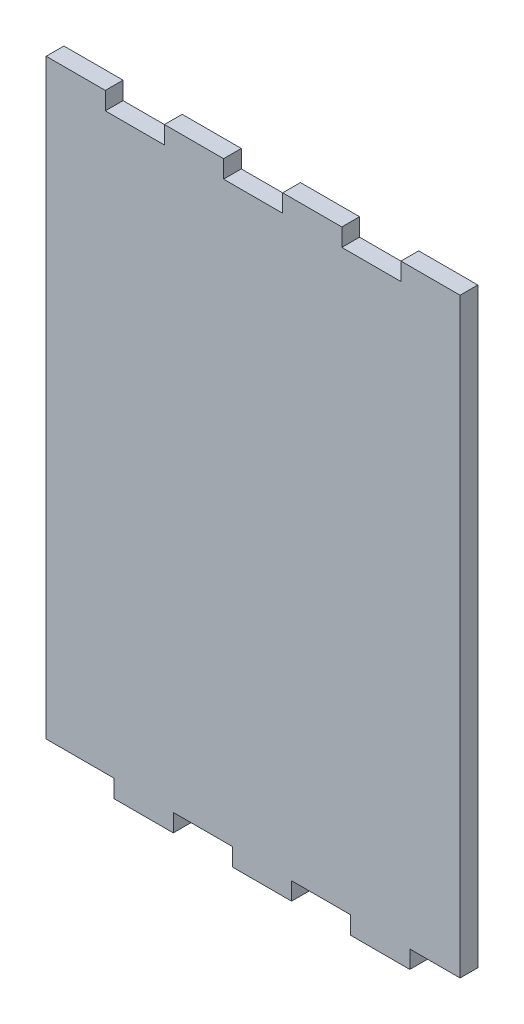
ISO-10303-21;
HEADER;
FILE_DESCRIPTION(('STEP AP214'),'2;1');
FILE_NAME('part.step','',(''),(''),'','','');
FILE_SCHEMA(('AUTOMOTIVE_DESIGN { 1 0 10303 214 1 1 1 1 }'));
ENDSEC;
DATA;
#1=APPLICATION_CONTEXT('core data for automotive mechanical design processes');
#2=APPLICATION_PROTOCOL_DEFINITION('international standard','automotive_design',2000,#1);
#3=PRODUCT_CONTEXT('',#1,'mechanical');
#4=PRODUCT('Part','Part','',(#3));
#5=PRODUCT_RELATED_PRODUCT_CATEGORY('part','',(#4));
#6=PRODUCT_DEFINITION_FORMATION('','',#4);
#7=PRODUCT_DEFINITION_CONTEXT('part definition',#1,'design');
#8=PRODUCT_DEFINITION('design','',#6,#7);
#9=PRODUCT_DEFINITION_SHAPE('','',#8);
#10=(LENGTH_UNIT() NAMED_UNIT(*) SI_UNIT(.MILLI.,.METRE.));
#11=(NAMED_UNIT(*) PLANE_ANGLE_UNIT() SI_UNIT($,.RADIAN.));
#12=(NAMED_UNIT(*) SI_UNIT($,.STERADIAN.) SOLID_ANGLE_UNIT());
#13=UNCERTAINTY_MEASURE_WITH_UNIT(LENGTH_MEASURE(1.E-05),#10,'distance_accuracy_value','');
#14=(GEOMETRIC_REPRESENTATION_CONTEXT(3) GLOBAL_UNCERTAINTY_ASSIGNED_CONTEXT((#13)) GLOBAL_UNIT_ASSIGNED_CONTEXT((#10,
#11,#12)) REPRESENTATION_CONTEXT('',''));
#15=CARTESIAN_POINT('',(0.,0.,0.));
#16=DIRECTION('',(0.,0.,1.));
#17=DIRECTION('',(1.,0.,0.));
#18=AXIS2_PLACEMENT_3D('',#15,#16,#17);
#19=CARTESIAN_POINT('',(0.,50.,3.));
#20=DIRECTION('',(0.,1.,0.));
#21=DIRECTION('',(0.,0.,1.));
#22=AXIS2_PLACEMENT_3D('',#19,#20,#21);
#23=PLANE('',#22);
#24=DIRECTION('',(0.,0.,1.));
#25=VECTOR('',#24,1.);
#26=CARTESIAN_POINT('',(-25.,50.,0.));
#27=LINE('',#26,#25);
#28=CARTESIAN_POINT('',(-25.,50.,0.));
#29=VERTEX_POINT('',#28);
#30=CARTESIAN_POINT('',(-25.,50.,3.));
#31=VERTEX_POINT('',#30);
#32=EDGE_CURVE('E268',#29,#31,#27,.T.);
#33=ORIENTED_EDGE('',*,*,#32,.F.);
#34=DIRECTION('',(1.,0.,0.));
#35=VECTOR('',#34,1.);
#36=CARTESIAN_POINT('',(0.,50.,0.));
#37=LINE('',#36,#35);
#38=CARTESIAN_POINT('',(-35.,50.,0.));
#39=VERTEX_POINT('',#38);
#40=EDGE_CURVE('E253',#39,#29,#37,.T.);
#41=ORIENTED_EDGE('',*,*,#40,.F.);
#42=DIRECTION('',(0.,0.,-1.));
#43=VECTOR('',#42,1.);
#44=CARTESIAN_POINT('',(-35.,50.,3.));
#45=LINE('',#44,#43);
#46=CARTESIAN_POINT('',(-35.,50.,3.));
#47=VERTEX_POINT('',#46);
#48=EDGE_CURVE('E453',#47,#39,#45,.T.);
#49=ORIENTED_EDGE('',*,*,#48,.F.);
#50=DIRECTION('',(1.,0.,0.));
#51=VECTOR('',#50,1.);
#52=CARTESIAN_POINT('',(0.,50.,3.));
#53=LINE('',#52,#51);
#54=EDGE_CURVE('E391',#47,#31,#53,.T.);
#55=ORIENTED_EDGE('',*,*,#54,.T.);
#56=EDGE_LOOP('',(#33,#41,#49,#55));
#57=FACE_BOUND('',#56,.T.);
#58=ADVANCED_FACE('F44',(#57),#23,.T.);
#59=DIRECTION('',(0.,0.,1.));
#60=VECTOR('',#59,1.);
#61=CARTESIAN_POINT('',(15.,50.,0.));
#62=LINE('',#61,#60);
#63=CARTESIAN_POINT('',(15.,50.,0.));
#64=VERTEX_POINT('',#63);
#65=CARTESIAN_POINT('',(15.,50.,3.));
#66=VERTEX_POINT('',#65);
#67=EDGE_CURVE('E288',#64,#66,#62,.T.);
#68=ORIENTED_EDGE('',*,*,#67,.F.);
#69=CARTESIAN_POINT('',(5.,50.,0.));
#70=VERTEX_POINT('',#69);
#71=EDGE_CURVE('E535',#70,#64,#37,.T.);
#72=ORIENTED_EDGE('',*,*,#71,.F.);
#73=DIRECTION('',(0.,0.,1.));
#74=VECTOR('',#73,1.);
#75=CARTESIAN_POINT('',(5.,50.,0.));
#76=LINE('',#75,#74);
#77=CARTESIAN_POINT('',(5.,50.,3.));
#78=VERTEX_POINT('',#77);
#79=EDGE_CURVE('E319',#70,#78,#76,.T.);
#80=ORIENTED_EDGE('',*,*,#79,.T.);
#81=EDGE_CURVE('E822',#78,#66,#53,.T.);
#82=ORIENTED_EDGE('',*,*,#81,.T.);
#83=EDGE_LOOP('',(#68,#72,#80,#82));
#84=FACE_BOUND('',#83,.T.);
#85=ADVANCED_FACE('F605',(#84),#23,.T.);
#86=DIRECTION('',(0.,0.,1.));
#87=VECTOR('',#86,1.);
#88=CARTESIAN_POINT('',(-15.,50.,0.));
#89=LINE('',#88,#87);
#90=CARTESIAN_POINT('',(-15.,50.,0.));
#91=VERTEX_POINT('',#90);
#92=CARTESIAN_POINT('',(-15.,50.,3.));
#93=VERTEX_POINT('',#92);
#94=EDGE_CURVE('E272',#91,#93,#89,.T.);
#95=ORIENTED_EDGE('',*,*,#94,.T.);
#96=CARTESIAN_POINT('',(-5.,50.,3.));
#97=VERTEX_POINT('',#96);
#98=EDGE_CURVE('E396',#93,#97,#53,.T.);
#99=ORIENTED_EDGE('',*,*,#98,.T.);
#100=DIRECTION('',(0.,0.,1.));
#101=VECTOR('',#100,1.);
#102=CARTESIAN_POINT('',(-5.,50.,0.));
#103=LINE('',#102,#101);
#104=CARTESIAN_POINT('',(-5.,50.,0.));
#105=VERTEX_POINT('',#104);
#106=EDGE_CURVE('E323',#105,#97,#103,.T.);
#107=ORIENTED_EDGE('',*,*,#106,.F.);
#108=EDGE_CURVE('E448',#91,#105,#37,.T.);
#109=ORIENTED_EDGE('',*,*,#108,.F.);
#110=EDGE_LOOP('',(#95,#99,#107,#109));
#111=FACE_BOUND('',#110,.T.);
#112=ADVANCED_FACE('F531',(#111),#23,.T.);
#113=CARTESIAN_POINT('',(0.,-50.,3.));
#114=DIRECTION('',(0.,1.,0.));
#115=DIRECTION('',(0.,0.,1.));
#116=AXIS2_PLACEMENT_3D('',#113,#114,#115);
#117=PLANE('',#116);
#118=DIRECTION('',(1.,0.,0.));
#119=VECTOR('',#118,1.);
#120=CARTESIAN_POINT('',(0.,-50.,0.));
#121=LINE('',#120,#119);
#122=CARTESIAN_POINT('',(-35.,-50.,0.));
#123=VERTEX_POINT('',#122);
#124=CARTESIAN_POINT('',(-23.5,-50.,0.));
#125=VERTEX_POINT('',#124);
#126=EDGE_CURVE('E271',#123,#125,#121,.T.);
#127=ORIENTED_EDGE('',*,*,#126,.T.);
#128=DIRECTION('',(0.,0.,-1.));
#129=VECTOR('',#128,1.);
#130=CARTESIAN_POINT('',(-23.5,-50.,3.));
#131=LINE('',#130,#129);
#132=CARTESIAN_POINT('',(-23.5,-50.,3.));
#133=VERTEX_POINT('',#132);
#134=EDGE_CURVE('E11',#133,#125,#131,.T.);
#135=ORIENTED_EDGE('',*,*,#134,.F.);
#136=DIRECTION('',(1.,0.,0.));
#137=VECTOR('',#136,1.);
#138=CARTESIAN_POINT('',(0.,-50.,3.));
#139=LINE('',#138,#137);
#140=CARTESIAN_POINT('',(-35.,-50.,3.));
#141=VERTEX_POINT('',#140);
#142=EDGE_CURVE('E347',#141,#133,#139,.T.);
#143=ORIENTED_EDGE('',*,*,#142,.F.);
#144=DIRECTION('',(0.,0.,-1.));
#145=VECTOR('',#144,1.);
#146=CARTESIAN_POINT('',(-35.,-50.,3.));
#147=LINE('',#146,#145);
#148=EDGE_CURVE('E400',#141,#123,#147,.T.);
#149=ORIENTED_EDGE('',*,*,#148,.T.);
#150=EDGE_LOOP('',(#127,#135,#143,#149));
#151=FACE_BOUND('',#150,.T.);
#152=ADVANCED_FACE('F519',(#151),#117,.F.);
#153=CARTESIAN_POINT('',(-23.5,0.,3.));
#154=DIRECTION('',(1.,0.,0.));
#155=DIRECTION('',(0.,0.,-1.));
#156=AXIS2_PLACEMENT_3D('',#153,#154,#155);
#157=PLANE('',#156);
#158=DIRECTION('',(0.,-1.,0.));
#159=VECTOR('',#158,1.);
#160=CARTESIAN_POINT('',(-23.5,0.,0.));
#161=LINE('',#160,#159);
#162=CARTESIAN_POINT('',(-23.5,-53.,0.));
#163=VERTEX_POINT('',#162);
#164=EDGE_CURVE('E404',#125,#163,#161,.T.);
#165=ORIENTED_EDGE('',*,*,#164,.T.);
#166=DIRECTION('',(0.,0.,-1.));
#167=VECTOR('',#166,1.);
#168=CARTESIAN_POINT('',(-23.5,-53.,3.));
#169=LINE('',#168,#167);
#170=CARTESIAN_POINT('',(-23.5,-53.,3.));
#171=VERTEX_POINT('',#170);
#172=EDGE_CURVE('E53',#171,#163,#169,.T.);
#173=ORIENTED_EDGE('',*,*,#172,.F.);
#174=DIRECTION('',(0.,-1.,0.));
#175=VECTOR('',#174,1.);
#176=CARTESIAN_POINT('',(-23.5,0.,3.));
#177=LINE('',#176,#175);
#178=EDGE_CURVE('E351',#133,#171,#177,.T.);
#179=ORIENTED_EDGE('',*,*,#178,.F.);
#180=ORIENTED_EDGE('',*,*,#134,.T.);
#181=EDGE_LOOP('',(#165,#173,#179,#180));
#182=FACE_BOUND('',#181,.T.);
#183=ADVANCED_FACE('F46',(#182),#157,.F.);
#184=CARTESIAN_POINT('',(0.,-53.,3.));
#185=DIRECTION('',(0.,-1.,0.));
#186=DIRECTION('',(1.,0.,0.));
#187=AXIS2_PLACEMENT_3D('',#184,#185,#186);
#188=PLANE('',#187);
#189=DIRECTION('',(-1.,0.,0.));
#190=VECTOR('',#189,1.);
#191=CARTESIAN_POINT('',(0.,-53.,0.));
#192=LINE('',#191,#190);
#193=CARTESIAN_POINT('',(-13.5,-53.,0.));
#194=VERTEX_POINT('',#193);
#195=EDGE_CURVE('E410',#194,#163,#192,.T.);
#196=ORIENTED_EDGE('',*,*,#195,.F.);
#197=DIRECTION('',(0.,0.,-1.));
#198=VECTOR('',#197,1.);
#199=CARTESIAN_POINT('',(-13.5,-53.,3.));
#200=LINE('',#199,#198);
#201=CARTESIAN_POINT('',(-13.5,-53.,3.));
#202=VERTEX_POINT('',#201);
#203=EDGE_CURVE('E495',#202,#194,#200,.T.);
#204=ORIENTED_EDGE('',*,*,#203,.F.);
#205=DIRECTION('',(-1.,0.,0.));
#206=VECTOR('',#205,1.);
#207=CARTESIAN_POINT('',(0.,-53.,3.));
#208=LINE('',#207,#206);
#209=EDGE_CURVE('E357',#202,#171,#208,.T.);
#210=ORIENTED_EDGE('',*,*,#209,.T.);
#211=ORIENTED_EDGE('',*,*,#172,.T.);
#212=EDGE_LOOP('',(#196,#204,#210,#211));
#213=FACE_BOUND('',#212,.T.);
#214=ADVANCED_FACE('F501',(#213),#188,.T.);
#215=CARTESIAN_POINT('',(-13.5,0.,3.));
#216=DIRECTION('',(1.,0.,0.));
#217=DIRECTION('',(0.,0.,-1.));
#218=AXIS2_PLACEMENT_3D('',#215,#216,#217);
#219=PLANE('',#218);
#220=DIRECTION('',(0.,-1.,0.));
#221=VECTOR('',#220,1.);
#222=CARTESIAN_POINT('',(-13.5,0.,0.));
#223=LINE('',#222,#221);
#224=CARTESIAN_POINT('',(-13.5,-50.,0.));
#225=VERTEX_POINT('',#224);
#226=EDGE_CURVE('E414',#225,#194,#223,.T.);
#227=ORIENTED_EDGE('',*,*,#226,.F.);
#228=DIRECTION('',(0.,0.,-1.));
#229=VECTOR('',#228,1.);
#230=CARTESIAN_POINT('',(-13.5,-50.,3.));
#231=LINE('',#230,#229);
#232=CARTESIAN_POINT('',(-13.5,-50.,3.));
#233=VERTEX_POINT('',#232);
#234=EDGE_CURVE('E492',#233,#225,#231,.T.);
#235=ORIENTED_EDGE('',*,*,#234,.F.);
#236=DIRECTION('',(0.,-1.,0.));
#237=VECTOR('',#236,1.);
#238=CARTESIAN_POINT('',(-13.5,0.,3.));
#239=LINE('',#238,#237);
#240=EDGE_CURVE('E361',#233,#202,#239,.T.);
#241=ORIENTED_EDGE('',*,*,#240,.T.);
#242=ORIENTED_EDGE('',*,*,#203,.T.);
#243=EDGE_LOOP('',(#227,#235,#241,#242));
#244=FACE_BOUND('',#243,.T.);
#245=ADVANCED_FACE('F510',(#244),#219,.T.);
#246=CARTESIAN_POINT('',(-3.5,-50.,0.));
#247=VERTEX_POINT('',#246);
#248=EDGE_CURVE('E406',#225,#247,#121,.T.);
#249=ORIENTED_EDGE('',*,*,#248,.T.);
#250=DIRECTION('',(0.,0.,-1.));
#251=VECTOR('',#250,1.);
#252=CARTESIAN_POINT('',(-3.5,-50.,3.));
#253=LINE('',#252,#251);
#254=CARTESIAN_POINT('',(-3.5,-50.,3.));
#255=VERTEX_POINT('',#254);
#256=EDGE_CURVE('E488',#255,#247,#253,.T.);
#257=ORIENTED_EDGE('',*,*,#256,.F.);
#258=EDGE_CURVE('E354',#233,#255,#139,.T.);
#259=ORIENTED_EDGE('',*,*,#258,.F.);
#260=ORIENTED_EDGE('',*,*,#234,.T.);
#261=EDGE_LOOP('',(#249,#257,#259,#260));
#262=FACE_BOUND('',#261,.T.);
#263=ADVANCED_FACE('F564',(#262),#117,.F.);
#264=CARTESIAN_POINT('',(-3.50000000000001,0.,3.));
#265=DIRECTION('',(1.,0.,0.));
#266=DIRECTION('',(0.,1.,0.));
#267=AXIS2_PLACEMENT_3D('',#264,#265,#266);
#268=PLANE('',#267);
#269=DIRECTION('',(0.,-1.,0.));
#270=VECTOR('',#269,1.);
#271=CARTESIAN_POINT('',(-3.50000000000001,0.,0.));
#272=LINE('',#271,#270);
#273=CARTESIAN_POINT('',(-3.5,-53.,0.));
#274=VERTEX_POINT('',#273);
#275=EDGE_CURVE('E418',#247,#274,#272,.T.);
#276=ORIENTED_EDGE('',*,*,#275,.T.);
#277=DIRECTION('',(0.,0.,-1.));
#278=VECTOR('',#277,1.);
#279=CARTESIAN_POINT('',(-3.5,-53.,3.));
#280=LINE('',#279,#278);
#281=CARTESIAN_POINT('',(-3.5,-53.,3.));
#282=VERTEX_POINT('',#281);
#283=EDGE_CURVE('E484',#282,#274,#280,.T.);
#284=ORIENTED_EDGE('',*,*,#283,.F.);
#285=DIRECTION('',(0.,-1.,0.));
#286=VECTOR('',#285,1.);
#287=CARTESIAN_POINT('',(-3.50000000000001,0.,3.));
#288=LINE('',#287,#286);
#289=EDGE_CURVE('E365',#255,#282,#288,.T.);
#290=ORIENTED_EDGE('',*,*,#289,.F.);
#291=ORIENTED_EDGE('',*,*,#256,.T.);
#292=EDGE_LOOP('',(#276,#284,#290,#291));
#293=FACE_BOUND('',#292,.T.);
#294=ADVANCED_FACE('F567',(#293),#268,.F.);
#295=CARTESIAN_POINT('',(0.,-53.,3.));
#296=DIRECTION('',(0.,1.,0.));
#297=DIRECTION('',(0.,0.,1.));
#298=AXIS2_PLACEMENT_3D('',#295,#296,#297);
#299=PLANE('',#298);
#300=DIRECTION('',(1.,0.,0.));
#301=VECTOR('',#300,1.);
#302=CARTESIAN_POINT('',(0.,-53.,0.));
#303=LINE('',#302,#301);
#304=CARTESIAN_POINT('',(6.5,-53.,0.));
#305=VERTEX_POINT('',#304);
#306=EDGE_CURVE('E421',#274,#305,#303,.T.);
#307=ORIENTED_EDGE('',*,*,#306,.T.);
#308=DIRECTION('',(0.,0.,-1.));
#309=VECTOR('',#308,1.);
#310=CARTESIAN_POINT('',(6.5,-53.,3.));
#311=LINE('',#310,#309);
#312=CARTESIAN_POINT('',(6.5,-53.,3.));
#313=VERTEX_POINT('',#312);
#314=EDGE_CURVE('E481',#313,#305,#311,.T.);
#315=ORIENTED_EDGE('',*,*,#314,.F.);
#316=DIRECTION('',(1.,0.,0.));
#317=VECTOR('',#316,1.);
#318=CARTESIAN_POINT('',(0.,-53.,3.));
#319=LINE('',#318,#317);
#320=EDGE_CURVE('E368',#282,#313,#319,.T.);
#321=ORIENTED_EDGE('',*,*,#320,.F.);
#322=ORIENTED_EDGE('',*,*,#283,.T.);
#323=EDGE_LOOP('',(#307,#315,#321,#322));
#324=FACE_BOUND('',#323,.T.);
#325=ADVANCED_FACE('F573',(#324),#299,.F.);
#326=CARTESIAN_POINT('',(6.5,0.,3.));
#327=DIRECTION('',(1.,0.,0.));
#328=DIRECTION('',(0.,0.,-1.));
#329=AXIS2_PLACEMENT_3D('',#326,#327,#328);
#330=PLANE('',#329);
#331=DIRECTION('',(0.,-1.,0.));
#332=VECTOR('',#331,1.);
#333=CARTESIAN_POINT('',(6.5,0.,0.));
#334=LINE('',#333,#332);
#335=CARTESIAN_POINT('',(6.5,-50.,0.));
#336=VERTEX_POINT('',#335);
#337=EDGE_CURVE('E425',#336,#305,#334,.T.);
#338=ORIENTED_EDGE('',*,*,#337,.F.);
#339=DIRECTION('',(0.,0.,-1.));
#340=VECTOR('',#339,1.);
#341=CARTESIAN_POINT('',(6.5,-50.,3.));
#342=LINE('',#341,#340);
#343=CARTESIAN_POINT('',(6.5,-50.,3.));
#344=VERTEX_POINT('',#343);
#345=EDGE_CURVE('E478',#344,#336,#342,.T.);
#346=ORIENTED_EDGE('',*,*,#345,.F.);
#347=DIRECTION('',(0.,-1.,0.));
#348=VECTOR('',#347,1.);
#349=CARTESIAN_POINT('',(6.5,0.,3.));
#350=LINE('',#349,#348);
#351=EDGE_CURVE('E371',#344,#313,#350,.T.);
#352=ORIENTED_EDGE('',*,*,#351,.T.);
#353=ORIENTED_EDGE('',*,*,#314,.T.);
#354=EDGE_LOOP('',(#338,#346,#352,#353));
#355=FACE_BOUND('',#354,.T.);
#356=ADVANCED_FACE('F594',(#355),#330,.T.);
#357=CARTESIAN_POINT('',(16.5,-50.,0.));
#358=VERTEX_POINT('',#357);
#359=EDGE_CURVE('E429',#336,#358,#121,.T.);
#360=ORIENTED_EDGE('',*,*,#359,.T.);
#361=DIRECTION('',(0.,0.,-1.));
#362=VECTOR('',#361,1.);
#363=CARTESIAN_POINT('',(16.5,-50.,3.));
#364=LINE('',#363,#362);
#365=CARTESIAN_POINT('',(16.5,-50.,3.));
#366=VERTEX_POINT('',#365);
#367=EDGE_CURVE('E474',#366,#358,#364,.T.);
#368=ORIENTED_EDGE('',*,*,#367,.F.);
#369=EDGE_CURVE('E375',#344,#366,#139,.T.);
#370=ORIENTED_EDGE('',*,*,#369,.F.);
#371=ORIENTED_EDGE('',*,*,#345,.T.);
#372=EDGE_LOOP('',(#360,#368,#370,#371));
#373=FACE_BOUND('',#372,.T.);
#374=ADVANCED_FACE('F592',(#373),#117,.F.);
#375=CARTESIAN_POINT('',(16.5000000000001,0.,3.));
#376=DIRECTION('',(1.,0.,0.));
#377=DIRECTION('',(0.,1.,0.));
#378=AXIS2_PLACEMENT_3D('',#375,#376,#377);
#379=PLANE('',#378);
#380=DIRECTION('',(0.,-1.,0.));
#381=VECTOR('',#380,1.);
#382=CARTESIAN_POINT('',(16.5000000000001,0.,0.));
#383=LINE('',#382,#381);
#384=CARTESIAN_POINT('',(16.5,-53.,0.));
#385=VERTEX_POINT('',#384);
#386=EDGE_CURVE('E430',#358,#385,#383,.T.);
#387=ORIENTED_EDGE('',*,*,#386,.T.);
#388=DIRECTION('',(0.,0.,-1.));
#389=VECTOR('',#388,1.);
#390=CARTESIAN_POINT('',(16.5,-53.,3.));
#391=LINE('',#390,#389);
#392=CARTESIAN_POINT('',(16.5,-53.,3.));
#393=VERTEX_POINT('',#392);
#394=EDGE_CURVE('E470',#393,#385,#391,.T.);
#395=ORIENTED_EDGE('',*,*,#394,.F.);
#396=DIRECTION('',(0.,-1.,0.));
#397=VECTOR('',#396,1.);
#398=CARTESIAN_POINT('',(16.5000000000001,0.,3.));
#399=LINE('',#398,#397);
#400=EDGE_CURVE('E376',#366,#393,#399,.T.);
#401=ORIENTED_EDGE('',*,*,#400,.F.);
#402=ORIENTED_EDGE('',*,*,#367,.T.);
#403=EDGE_LOOP('',(#387,#395,#401,#402));
#404=FACE_BOUND('',#403,.T.);
#405=ADVANCED_FACE('F591',(#404),#379,.F.);
#406=CARTESIAN_POINT('',(0.,-53.,3.));
#407=DIRECTION('',(0.,1.,0.));
#408=DIRECTION('',(-1.,0.,0.));
#409=AXIS2_PLACEMENT_3D('',#406,#407,#408);
#410=PLANE('',#409);
#411=DIRECTION('',(1.,0.,0.));
#412=VECTOR('',#411,1.);
#413=CARTESIAN_POINT('',(0.,-53.,0.));
#414=LINE('',#413,#412);
#415=CARTESIAN_POINT('',(26.5,-53.,0.));
#416=VERTEX_POINT('',#415);
#417=EDGE_CURVE('E433',#385,#416,#414,.T.);
#418=ORIENTED_EDGE('',*,*,#417,.T.);
#419=DIRECTION('',(0.,0.,-1.));
#420=VECTOR('',#419,1.);
#421=CARTESIAN_POINT('',(26.5,-53.,3.));
#422=LINE('',#421,#420);
#423=CARTESIAN_POINT('',(26.5,-53.,3.));
#424=VERTEX_POINT('',#423);
#425=EDGE_CURVE('E467',#424,#416,#422,.T.);
#426=ORIENTED_EDGE('',*,*,#425,.F.);
#427=DIRECTION('',(1.,0.,0.));
#428=VECTOR('',#427,1.);
#429=CARTESIAN_POINT('',(0.,-53.,3.));
#430=LINE('',#429,#428);
#431=EDGE_CURVE('E379',#393,#424,#430,.T.);
#432=ORIENTED_EDGE('',*,*,#431,.F.);
#433=ORIENTED_EDGE('',*,*,#394,.T.);
#434=EDGE_LOOP('',(#418,#426,#432,#433));
#435=FACE_BOUND('',#434,.T.);
#436=ADVANCED_FACE('F587',(#435),#410,.F.);
#437=CARTESIAN_POINT('',(26.5,0.,3.));
#438=DIRECTION('',(1.,0.,0.));
#439=DIRECTION('',(0.,0.,-1.));
#440=AXIS2_PLACEMENT_3D('',#437,#438,#439);
#441=PLANE('',#440);
#442=DIRECTION('',(0.,-1.,0.));
#443=VECTOR('',#442,1.);
#444=CARTESIAN_POINT('',(26.5,0.,0.));
#445=LINE('',#444,#443);
#446=CARTESIAN_POINT('',(26.5,-50.,0.));
#447=VERTEX_POINT('',#446);
#448=EDGE_CURVE('E437',#447,#416,#445,.T.);
#449=ORIENTED_EDGE('',*,*,#448,.F.);
#450=DIRECTION('',(0.,0.,-1.));
#451=VECTOR('',#450,1.);
#452=CARTESIAN_POINT('',(26.5,-50.,3.));
#453=LINE('',#452,#451);
#454=CARTESIAN_POINT('',(26.5,-50.,3.));
#455=VERTEX_POINT('',#454);
#456=EDGE_CURVE('E464',#455,#447,#453,.T.);
#457=ORIENTED_EDGE('',*,*,#456,.F.);
#458=DIRECTION('',(0.,-1.,0.));
#459=VECTOR('',#458,1.);
#460=CARTESIAN_POINT('',(26.5,0.,3.));
#461=LINE('',#460,#459);
#462=EDGE_CURVE('E382',#455,#424,#461,.T.);
#463=ORIENTED_EDGE('',*,*,#462,.T.);
#464=ORIENTED_EDGE('',*,*,#425,.T.);
#465=EDGE_LOOP('',(#449,#457,#463,#464));
#466=FACE_BOUND('',#465,.T.);
#467=ADVANCED_FACE('F583',(#466),#441,.T.);
#468=CARTESIAN_POINT('',(35.,-50.,0.));
#469=VERTEX_POINT('',#468);
#470=EDGE_CURVE('E405',#447,#469,#121,.T.);
#471=ORIENTED_EDGE('',*,*,#470,.T.);
#472=DIRECTION('',(0.,0.,-1.));
#473=VECTOR('',#472,1.);
#474=CARTESIAN_POINT('',(35.,-50.,3.));
#475=LINE('',#474,#473);
#476=CARTESIAN_POINT('',(35.,-50.,3.));
#477=VERTEX_POINT('',#476);
#478=EDGE_CURVE('E460',#477,#469,#475,.T.);
#479=ORIENTED_EDGE('',*,*,#478,.F.);
#480=EDGE_CURVE('E353',#455,#477,#139,.T.);
#481=ORIENTED_EDGE('',*,*,#480,.F.);
#482=ORIENTED_EDGE('',*,*,#456,.T.);
#483=EDGE_LOOP('',(#471,#479,#481,#482));
#484=FACE_BOUND('',#483,.T.);
#485=ADVANCED_FACE('F553',(#484),#117,.F.);
#486=CARTESIAN_POINT('',(35.,0.,3.));
#487=DIRECTION('',(-1.,0.,0.));
#488=DIRECTION('',(0.,0.,1.));
#489=AXIS2_PLACEMENT_3D('',#486,#487,#488);
#490=PLANE('',#489);
#491=DIRECTION('',(0.,1.,0.));
#492=VECTOR('',#491,1.);
#493=CARTESIAN_POINT('',(35.,0.,0.));
#494=LINE('',#493,#492);
#495=CARTESIAN_POINT('',(35.,50.,0.));
#496=VERTEX_POINT('',#495);
#497=EDGE_CURVE('E441',#469,#496,#494,.T.);
#498=ORIENTED_EDGE('',*,*,#497,.T.);
#499=DIRECTION('',(0.,0.,-1.));
#500=VECTOR('',#499,1.);
#501=CARTESIAN_POINT('',(35.,50.,3.));
#502=LINE('',#501,#500);
#503=CARTESIAN_POINT('',(35.,50.,3.));
#504=VERTEX_POINT('',#503);
#505=EDGE_CURVE('E456',#504,#496,#502,.T.);
#506=ORIENTED_EDGE('',*,*,#505,.F.);
#507=DIRECTION('',(0.,1.,0.));
#508=VECTOR('',#507,1.);
#509=CARTESIAN_POINT('',(35.,0.,3.));
#510=LINE('',#509,#508);
#511=EDGE_CURVE('E386',#477,#504,#510,.T.);
#512=ORIENTED_EDGE('',*,*,#511,.F.);
#513=ORIENTED_EDGE('',*,*,#478,.T.);
#514=EDGE_LOOP('',(#498,#506,#512,#513));
#515=FACE_BOUND('',#514,.T.);
#516=ADVANCED_FACE('F549',(#515),#490,.F.);
#517=DIRECTION('',(0.,0.,1.));
#518=VECTOR('',#517,1.);
#519=CARTESIAN_POINT('',(25.,50.,0.));
#520=LINE('',#519,#518);
#521=CARTESIAN_POINT('',(25.,50.,0.));
#522=VERTEX_POINT('',#521);
#523=CARTESIAN_POINT('',(25.,50.,3.));
#524=VERTEX_POINT('',#523);
#525=EDGE_CURVE('E284',#522,#524,#520,.T.);
#526=ORIENTED_EDGE('',*,*,#525,.T.);
#527=EDGE_CURVE('E390',#524,#504,#53,.T.);
#528=ORIENTED_EDGE('',*,*,#527,.T.);
#529=ORIENTED_EDGE('',*,*,#505,.T.);
#530=EDGE_CURVE('E445',#522,#496,#37,.T.);
#531=ORIENTED_EDGE('',*,*,#530,.F.);
#532=EDGE_LOOP('',(#526,#528,#529,#531));
#533=FACE_BOUND('',#532,.T.);
#534=ADVANCED_FACE('F545',(#533),#23,.T.);
#535=CARTESIAN_POINT('',(-35.,0.,3.));
#536=DIRECTION('',(-1.,0.,0.));
#537=DIRECTION('',(0.,0.,1.));
#538=AXIS2_PLACEMENT_3D('',#535,#536,#537);
#539=PLANE('',#538);
#540=DIRECTION('',(0.,1.,0.));
#541=VECTOR('',#540,1.);
#542=CARTESIAN_POINT('',(-35.,0.,0.));
#543=LINE('',#542,#541);
#544=EDGE_CURVE('E352',#123,#39,#543,.T.);
#545=ORIENTED_EDGE('',*,*,#544,.F.);
#546=ORIENTED_EDGE('',*,*,#148,.F.);
#547=DIRECTION('',(0.,1.,0.));
#548=VECTOR('',#547,1.);
#549=CARTESIAN_POINT('',(-35.,0.,3.));
#550=LINE('',#549,#548);
#551=EDGE_CURVE('E395',#141,#47,#550,.T.);
#552=ORIENTED_EDGE('',*,*,#551,.T.);
#553=ORIENTED_EDGE('',*,*,#48,.T.);
#554=EDGE_LOOP('',(#545,#546,#552,#553));
#555=FACE_BOUND('',#554,.T.);
#556=ADVANCED_FACE('F522',(#555),#539,.T.);
#557=CARTESIAN_POINT('',(0.,0.,3.));
#558=DIRECTION('',(0.,0.,1.));
#559=DIRECTION('',(1.,0.,0.));
#560=AXIS2_PLACEMENT_3D('',#557,#558,#559);
#561=PLANE('',#560);
#562=DIRECTION('',(0.,-1.,0.));
#563=VECTOR('',#562,1.);
#564=CARTESIAN_POINT('',(-25.,50.,3.));
#565=LINE('',#564,#563);
#566=CARTESIAN_POINT('',(-25.,47.,3.));
#567=VERTEX_POINT('',#566);
#568=EDGE_CURVE('E236',#31,#567,#565,.T.);
#569=ORIENTED_EDGE('',*,*,#568,.F.);
#570=ORIENTED_EDGE('',*,*,#54,.F.);
#571=ORIENTED_EDGE('',*,*,#551,.F.);
#572=ORIENTED_EDGE('',*,*,#142,.T.);
#573=ORIENTED_EDGE('',*,*,#178,.T.);
#574=ORIENTED_EDGE('',*,*,#209,.F.);
#575=ORIENTED_EDGE('',*,*,#240,.F.);
#576=ORIENTED_EDGE('',*,*,#258,.T.);
#577=ORIENTED_EDGE('',*,*,#289,.T.);
#578=ORIENTED_EDGE('',*,*,#320,.T.);
#579=ORIENTED_EDGE('',*,*,#351,.F.);
#580=ORIENTED_EDGE('',*,*,#369,.T.);
#581=ORIENTED_EDGE('',*,*,#400,.T.);
#582=ORIENTED_EDGE('',*,*,#431,.T.);
#583=ORIENTED_EDGE('',*,*,#462,.F.);
#584=ORIENTED_EDGE('',*,*,#480,.T.);
#585=ORIENTED_EDGE('',*,*,#511,.T.);
#586=ORIENTED_EDGE('',*,*,#527,.F.);
#587=DIRECTION('',(0.,1.,0.));
#588=VECTOR('',#587,1.);
#589=CARTESIAN_POINT('',(25.,50.,3.));
#590=LINE('',#589,#588);
#591=CARTESIAN_POINT('',(25.,47.,3.));
#592=VERTEX_POINT('',#591);
#593=EDGE_CURVE('E292',#592,#524,#590,.T.);
#594=ORIENTED_EDGE('',*,*,#593,.F.);
#595=DIRECTION('',(1.,0.,0.));
#596=VECTOR('',#595,1.);
#597=CARTESIAN_POINT('',(15.,47.,3.));
#598=LINE('',#597,#596);
#599=CARTESIAN_POINT('',(15.,47.,3.));
#600=VERTEX_POINT('',#599);
#601=EDGE_CURVE('E295',#600,#592,#598,.T.);
#602=ORIENTED_EDGE('',*,*,#601,.F.);
#603=DIRECTION('',(0.,-1.,0.));
#604=VECTOR('',#603,1.);
#605=CARTESIAN_POINT('',(15.,50.,3.));
#606=LINE('',#605,#604);
#607=EDGE_CURVE('E265',#66,#600,#606,.T.);
#608=ORIENTED_EDGE('',*,*,#607,.F.);
#609=ORIENTED_EDGE('',*,*,#81,.F.);
#610=DIRECTION('',(0.,1.,0.));
#611=VECTOR('',#610,1.);
#612=CARTESIAN_POINT('',(5.,50.,3.));
#613=LINE('',#612,#611);
#614=CARTESIAN_POINT('',(5.,47.,3.));
#615=VERTEX_POINT('',#614);
#616=EDGE_CURVE('E326',#615,#78,#613,.T.);
#617=ORIENTED_EDGE('',*,*,#616,.F.);
#618=DIRECTION('',(1.,0.,0.));
#619=VECTOR('',#618,1.);
#620=CARTESIAN_POINT('',(-5.,47.,3.));
#621=LINE('',#620,#619);
#622=CARTESIAN_POINT('',(-5.,47.,3.));
#623=VERTEX_POINT('',#622);
#624=EDGE_CURVE('E329',#623,#615,#621,.T.);
#625=ORIENTED_EDGE('',*,*,#624,.F.);
#626=DIRECTION('',(0.,-1.,0.));
#627=VECTOR('',#626,1.);
#628=CARTESIAN_POINT('',(-5.,50.,3.));
#629=LINE('',#628,#627);
#630=EDGE_CURVE('E291',#97,#623,#629,.T.);
#631=ORIENTED_EDGE('',*,*,#630,.F.);
#632=ORIENTED_EDGE('',*,*,#98,.F.);
#633=DIRECTION('',(0.,1.,0.));
#634=VECTOR('',#633,1.);
#635=CARTESIAN_POINT('',(-15.,50.,3.));
#636=LINE('',#635,#634);
#637=CARTESIAN_POINT('',(-15.,47.,3.));
#638=VERTEX_POINT('',#637);
#639=EDGE_CURVE('E255',#638,#93,#636,.T.);
#640=ORIENTED_EDGE('',*,*,#639,.F.);
#641=DIRECTION('',(1.,0.,0.));
#642=VECTOR('',#641,1.);
#643=CARTESIAN_POINT('',(-25.,47.,3.));
#644=LINE('',#643,#642);
#645=EDGE_CURVE('E258',#567,#638,#644,.T.);
#646=ORIENTED_EDGE('',*,*,#645,.F.);
#647=EDGE_LOOP('',(#569,#570,#571,#572,#573,#574,#575,#576,#577,#578,#579,#580,#581,#582,#583,
#584,#585,#586,#594,#602,#608,#609,#617,#625,#631,#632,#640,#646));
#648=FACE_BOUND('',#647,.T.);
#649=ADVANCED_FACE('F514',(#648),#561,.T.);
#650=CARTESIAN_POINT('',(0.,0.,0.));
#651=DIRECTION('',(0.,0.,1.));
#652=DIRECTION('',(1.,0.,0.));
#653=AXIS2_PLACEMENT_3D('',#650,#651,#652);
#654=PLANE('',#653);
#655=ORIENTED_EDGE('',*,*,#40,.T.);
#656=DIRECTION('',(0.,-1.,0.));
#657=VECTOR('',#656,1.);
#658=CARTESIAN_POINT('',(-25.,50.,0.));
#659=LINE('',#658,#657);
#660=CARTESIAN_POINT('',(-25.,47.,0.));
#661=VERTEX_POINT('',#660);
#662=EDGE_CURVE('E233',#29,#661,#659,.T.);
#663=ORIENTED_EDGE('',*,*,#662,.T.);
#664=DIRECTION('',(1.,0.,0.));
#665=VECTOR('',#664,1.);
#666=CARTESIAN_POINT('',(-25.,47.,0.));
#667=LINE('',#666,#665);
#668=CARTESIAN_POINT('',(-15.,47.,0.));
#669=VERTEX_POINT('',#668);
#670=EDGE_CURVE('E244',#661,#669,#667,.T.);
#671=ORIENTED_EDGE('',*,*,#670,.T.);
#672=DIRECTION('',(0.,1.,0.));
#673=VECTOR('',#672,1.);
#674=CARTESIAN_POINT('',(-15.,50.,0.));
#675=LINE('',#674,#673);
#676=EDGE_CURVE('E60',#669,#91,#675,.T.);
#677=ORIENTED_EDGE('',*,*,#676,.T.);
#678=ORIENTED_EDGE('',*,*,#108,.T.);
#679=DIRECTION('',(0.,-1.,0.));
#680=VECTOR('',#679,1.);
#681=CARTESIAN_POINT('',(-5.,50.,0.));
#682=LINE('',#681,#680);
#683=CARTESIAN_POINT('',(-5.,47.,0.));
#684=VERTEX_POINT('',#683);
#685=EDGE_CURVE('E330',#105,#684,#682,.T.);
#686=ORIENTED_EDGE('',*,*,#685,.T.);
#687=DIRECTION('',(1.,0.,0.));
#688=VECTOR('',#687,1.);
#689=CARTESIAN_POINT('',(-5.,47.,0.));
#690=LINE('',#689,#688);
#691=CARTESIAN_POINT('',(5.,47.,0.));
#692=VERTEX_POINT('',#691);
#693=EDGE_CURVE('E340',#684,#692,#690,.T.);
#694=ORIENTED_EDGE('',*,*,#693,.T.);
#695=DIRECTION('',(0.,1.,0.));
#696=VECTOR('',#695,1.);
#697=CARTESIAN_POINT('',(5.,50.,0.));
#698=LINE('',#697,#696);
#699=EDGE_CURVE('E315',#692,#70,#698,.T.);
#700=ORIENTED_EDGE('',*,*,#699,.T.);
#701=ORIENTED_EDGE('',*,*,#71,.T.);
#702=DIRECTION('',(0.,-1.,0.));
#703=VECTOR('',#702,1.);
#704=CARTESIAN_POINT('',(15.,50.,0.));
#705=LINE('',#704,#703);
#706=CARTESIAN_POINT('',(15.,47.,0.));
#707=VERTEX_POINT('',#706);
#708=EDGE_CURVE('E296',#64,#707,#705,.T.);
#709=ORIENTED_EDGE('',*,*,#708,.T.);
#710=DIRECTION('',(1.,0.,0.));
#711=VECTOR('',#710,1.);
#712=CARTESIAN_POINT('',(15.,47.,0.));
#713=LINE('',#712,#711);
#714=CARTESIAN_POINT('',(25.,47.,0.));
#715=VERTEX_POINT('',#714);
#716=EDGE_CURVE('E305',#707,#715,#713,.T.);
#717=ORIENTED_EDGE('',*,*,#716,.T.);
#718=DIRECTION('',(0.,1.,0.));
#719=VECTOR('',#718,1.);
#720=CARTESIAN_POINT('',(25.,50.,0.));
#721=LINE('',#720,#719);
#722=EDGE_CURVE('E68',#715,#522,#721,.T.);
#723=ORIENTED_EDGE('',*,*,#722,.T.);
#724=ORIENTED_EDGE('',*,*,#530,.T.);
#725=ORIENTED_EDGE('',*,*,#497,.F.);
#726=ORIENTED_EDGE('',*,*,#470,.F.);
#727=ORIENTED_EDGE('',*,*,#448,.T.);
#728=ORIENTED_EDGE('',*,*,#417,.F.);
#729=ORIENTED_EDGE('',*,*,#386,.F.);
#730=ORIENTED_EDGE('',*,*,#359,.F.);
#731=ORIENTED_EDGE('',*,*,#337,.T.);
#732=ORIENTED_EDGE('',*,*,#306,.F.);
#733=ORIENTED_EDGE('',*,*,#275,.F.);
#734=ORIENTED_EDGE('',*,*,#248,.F.);
#735=ORIENTED_EDGE('',*,*,#226,.T.);
#736=ORIENTED_EDGE('',*,*,#195,.T.);
#737=ORIENTED_EDGE('',*,*,#164,.F.);
#738=ORIENTED_EDGE('',*,*,#126,.F.);
#739=ORIENTED_EDGE('',*,*,#544,.T.);
#740=EDGE_LOOP('',(#655,#663,#671,#677,#678,#686,#694,#700,#701,#709,#717,#723,#724,#725,#726,
#727,#728,#729,#730,#731,#732,#733,#734,#735,#736,#737,#738,#739));
#741=FACE_BOUND('',#740,.T.);
#742=ADVANCED_FACE('F250',(#741),#654,.F.);
#743=CARTESIAN_POINT('',(-5.,50.,0.));
#744=DIRECTION('',(-1.,0.,0.));
#745=DIRECTION('',(0.,0.,1.));
#746=AXIS2_PLACEMENT_3D('',#743,#744,#745);
#747=PLANE('',#746);
#748=ORIENTED_EDGE('',*,*,#630,.T.);
#749=DIRECTION('',(0.,0.,1.));
#750=VECTOR('',#749,1.);
#751=CARTESIAN_POINT('',(-5.,47.,0.));
#752=LINE('',#751,#750);
#753=EDGE_CURVE('E312',#684,#623,#752,.T.);
#754=ORIENTED_EDGE('',*,*,#753,.F.);
#755=ORIENTED_EDGE('',*,*,#685,.F.);
#756=ORIENTED_EDGE('',*,*,#106,.T.);
#757=EDGE_LOOP('',(#748,#754,#755,#756));
#758=FACE_BOUND('',#757,.T.);
#759=ADVANCED_FACE('F712',(#758),#747,.F.);
#760=CARTESIAN_POINT('',(5.,50.,0.));
#761=DIRECTION('',(1.,0.,0.));
#762=DIRECTION('',(0.,0.,-1.));
#763=AXIS2_PLACEMENT_3D('',#760,#761,#762);
#764=PLANE('',#763);
#765=ORIENTED_EDGE('',*,*,#616,.T.);
#766=ORIENTED_EDGE('',*,*,#79,.F.);
#767=ORIENTED_EDGE('',*,*,#699,.F.);
#768=DIRECTION('',(0.,0.,1.));
#769=VECTOR('',#768,1.);
#770=CARTESIAN_POINT('',(5.,47.,0.));
#771=LINE('',#770,#769);
#772=EDGE_CURVE('E316',#692,#615,#771,.T.);
#773=ORIENTED_EDGE('',*,*,#772,.T.);
#774=EDGE_LOOP('',(#765,#766,#767,#773));
#775=FACE_BOUND('',#774,.T.);
#776=ADVANCED_FACE('F721',(#775),#764,.F.);
#777=CARTESIAN_POINT('',(-5.,47.,0.));
#778=DIRECTION('',(0.,-1.,0.));
#779=DIRECTION('',(0.,0.,-1.));
#780=AXIS2_PLACEMENT_3D('',#777,#778,#779);
#781=PLANE('',#780);
#782=ORIENTED_EDGE('',*,*,#624,.T.);
#783=ORIENTED_EDGE('',*,*,#772,.F.);
#784=ORIENTED_EDGE('',*,*,#693,.F.);
#785=ORIENTED_EDGE('',*,*,#753,.T.);
#786=EDGE_LOOP('',(#782,#783,#784,#785));
#787=FACE_BOUND('',#786,.T.);
#788=ADVANCED_FACE('F732',(#787),#781,.F.);
#789=CARTESIAN_POINT('',(15.,50.,0.));
#790=DIRECTION('',(-1.,0.,0.));
#791=DIRECTION('',(0.,-1.,0.));
#792=AXIS2_PLACEMENT_3D('',#789,#790,#791);
#793=PLANE('',#792);
#794=ORIENTED_EDGE('',*,*,#607,.T.);
#795=DIRECTION('',(0.,0.,1.));
#796=VECTOR('',#795,1.);
#797=CARTESIAN_POINT('',(15.,47.,0.));
#798=LINE('',#797,#796);
#799=EDGE_CURVE('E278',#707,#600,#798,.T.);
#800=ORIENTED_EDGE('',*,*,#799,.F.);
#801=ORIENTED_EDGE('',*,*,#708,.F.);
#802=ORIENTED_EDGE('',*,*,#67,.T.);
#803=EDGE_LOOP('',(#794,#800,#801,#802));
#804=FACE_BOUND('',#803,.T.);
#805=ADVANCED_FACE('F743',(#804),#793,.F.);
#806=CARTESIAN_POINT('',(25.,50.,0.));
#807=DIRECTION('',(1.,0.,0.));
#808=DIRECTION('',(0.,0.,-1.));
#809=AXIS2_PLACEMENT_3D('',#806,#807,#808);
#810=PLANE('',#809);
#811=ORIENTED_EDGE('',*,*,#593,.T.);
#812=ORIENTED_EDGE('',*,*,#525,.F.);
#813=ORIENTED_EDGE('',*,*,#722,.F.);
#814=DIRECTION('',(0.,0.,1.));
#815=VECTOR('',#814,1.);
#816=CARTESIAN_POINT('',(25.,47.,0.));
#817=LINE('',#816,#815);
#818=EDGE_CURVE('E281',#715,#592,#817,.T.);
#819=ORIENTED_EDGE('',*,*,#818,.T.);
#820=EDGE_LOOP('',(#811,#812,#813,#819));
#821=FACE_BOUND('',#820,.T.);
#822=ADVANCED_FACE('F754',(#821),#810,.F.);
#823=CARTESIAN_POINT('',(15.,47.,0.));
#824=DIRECTION('',(0.,-1.,0.));
#825=DIRECTION('',(1.,0.,0.));
#826=AXIS2_PLACEMENT_3D('',#823,#824,#825);
#827=PLANE('',#826);
#828=ORIENTED_EDGE('',*,*,#601,.T.);
#829=ORIENTED_EDGE('',*,*,#818,.F.);
#830=ORIENTED_EDGE('',*,*,#716,.F.);
#831=ORIENTED_EDGE('',*,*,#799,.T.);
#832=EDGE_LOOP('',(#828,#829,#830,#831));
#833=FACE_BOUND('',#832,.T.);
#834=ADVANCED_FACE('F765',(#833),#827,.F.);
#835=CARTESIAN_POINT('',(-25.,50.,0.));
#836=DIRECTION('',(-1.,0.,0.));
#837=DIRECTION('',(0.,0.,1.));
#838=AXIS2_PLACEMENT_3D('',#835,#836,#837);
#839=PLANE('',#838);
#840=ORIENTED_EDGE('',*,*,#568,.T.);
#841=DIRECTION('',(0.,0.,1.));
#842=VECTOR('',#841,1.);
#843=CARTESIAN_POINT('',(-25.,47.,0.));
#844=LINE('',#843,#842);
#845=EDGE_CURVE('E229',#661,#567,#844,.T.);
#846=ORIENTED_EDGE('',*,*,#845,.F.);
#847=ORIENTED_EDGE('',*,*,#662,.F.);
#848=ORIENTED_EDGE('',*,*,#32,.T.);
#849=EDGE_LOOP('',(#840,#846,#847,#848));
#850=FACE_BOUND('',#849,.T.);
#851=ADVANCED_FACE('F231',(#850),#839,.F.);
#852=CARTESIAN_POINT('',(-15.,50.,0.));
#853=DIRECTION('',(1.,0.,0.));
#854=DIRECTION('',(0.,0.,-1.));
#855=AXIS2_PLACEMENT_3D('',#852,#853,#854);
#856=PLANE('',#855);
#857=ORIENTED_EDGE('',*,*,#639,.T.);
#858=ORIENTED_EDGE('',*,*,#94,.F.);
#859=ORIENTED_EDGE('',*,*,#676,.F.);
#860=DIRECTION('',(0.,0.,1.));
#861=VECTOR('',#860,1.);
#862=CARTESIAN_POINT('',(-15.,47.,0.));
#863=LINE('',#862,#861);
#864=EDGE_CURVE('E241',#669,#638,#863,.T.);
#865=ORIENTED_EDGE('',*,*,#864,.T.);
#866=EDGE_LOOP('',(#857,#858,#859,#865));
#867=FACE_BOUND('',#866,.T.);
#868=ADVANCED_FACE('F528',(#867),#856,.F.);
#869=CARTESIAN_POINT('',(-25.,47.,0.));
#870=DIRECTION('',(0.,-1.,0.));
#871=DIRECTION('',(1.,0.,0.));
#872=AXIS2_PLACEMENT_3D('',#869,#870,#871);
#873=PLANE('',#872);
#874=ORIENTED_EDGE('',*,*,#645,.T.);
#875=ORIENTED_EDGE('',*,*,#864,.F.);
#876=ORIENTED_EDGE('',*,*,#670,.F.);
#877=ORIENTED_EDGE('',*,*,#845,.T.);
#878=EDGE_LOOP('',(#874,#875,#876,#877));
#879=FACE_BOUND('',#878,.T.);
#880=ADVANCED_FACE('F245',(#879),#873,.F.);
#881=CLOSED_SHELL('',(#58,#85,#112,#152,#183,#214,#245,#263,#294,#325,#356,#374,#405,#436,#467,
#485,#516,#534,#556,#649,#742,#759,#776,#788,#805,#822,#834,#851,#868,#880));
#882=MANIFOLD_SOLID_BREP('B2',#881);
#883=ADVANCED_BREP_SHAPE_REPRESENTATION('',(#18,#882),#14);
#884=SHAPE_DEFINITION_REPRESENTATION(#9,#883);
ENDSEC;
END-ISO-10303-21;
